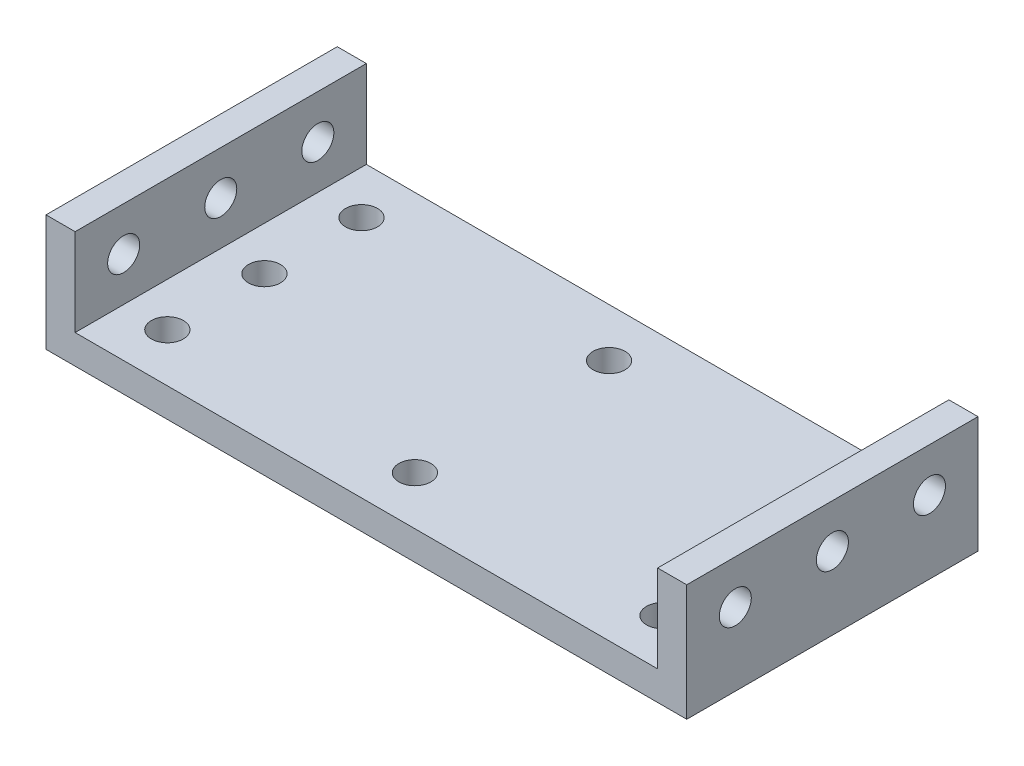
ISO-10303-21;
HEADER;
FILE_DESCRIPTION(('STEP AP214'),'2;1');
FILE_NAME('part.step','',(''),(''),'','','');
FILE_SCHEMA(('AUTOMOTIVE_DESIGN { 1 0 10303 214 1 1 1 1 }'));
ENDSEC;
DATA;
#1=APPLICATION_CONTEXT('core data for automotive mechanical design processes');
#2=APPLICATION_PROTOCOL_DEFINITION('international standard','automotive_design',2000,#1);
#3=PRODUCT_CONTEXT('',#1,'mechanical');
#4=PRODUCT('Part','Part','',(#3));
#5=PRODUCT_RELATED_PRODUCT_CATEGORY('part','',(#4));
#6=PRODUCT_DEFINITION_FORMATION('','',#4);
#7=PRODUCT_DEFINITION_CONTEXT('part definition',#1,'design');
#8=PRODUCT_DEFINITION('design','',#6,#7);
#9=PRODUCT_DEFINITION_SHAPE('','',#8);
#10=(LENGTH_UNIT() NAMED_UNIT(*) SI_UNIT(.MILLI.,.METRE.));
#11=(NAMED_UNIT(*) PLANE_ANGLE_UNIT() SI_UNIT($,.RADIAN.));
#12=(NAMED_UNIT(*) SI_UNIT($,.STERADIAN.) SOLID_ANGLE_UNIT());
#13=UNCERTAINTY_MEASURE_WITH_UNIT(LENGTH_MEASURE(1.E-05),#10,'distance_accuracy_value','');
#14=(GEOMETRIC_REPRESENTATION_CONTEXT(3) GLOBAL_UNCERTAINTY_ASSIGNED_CONTEXT((#13)) GLOBAL_UNIT_ASSIGNED_CONTEXT((#10,
#11,#12)) REPRESENTATION_CONTEXT('',''));
#15=CARTESIAN_POINT('',(0.,0.,0.));
#16=DIRECTION('',(0.,0.,1.));
#17=DIRECTION('',(1.,0.,0.));
#18=AXIS2_PLACEMENT_3D('',#15,#16,#17);
#19=CARTESIAN_POINT('',(60.,0.,30.));
#20=DIRECTION('',(0.,-1.,0.));
#21=DIRECTION('',(1.,0.,0.));
#22=AXIS2_PLACEMENT_3D('',#19,#20,#21);
#23=PLANE('',#22);
#24=CARTESIAN_POINT('',(55.5,0.,5.));
#25=DIRECTION('',(0.,1.,0.));
#26=DIRECTION('',(-1.,0.,0.));
#27=AXIS2_PLACEMENT_3D('',#24,#25,#26);
#28=CIRCLE('',#27,1.65);
#29=CARTESIAN_POINT('',(53.85,0.,5.));
#30=VERTEX_POINT('',#29);
#31=EDGE_CURVE('E263',#30,#30,#28,.T.);
#32=ORIENTED_EDGE('',*,*,#31,.F.);
#33=EDGE_LOOP('',(#32));
#34=FACE_BOUND('',#33,.T.);
#35=CARTESIAN_POINT('',(55.5,0.,15.));
#36=DIRECTION('',(0.,1.,0.));
#37=DIRECTION('',(-1.,0.,0.));
#38=AXIS2_PLACEMENT_3D('',#35,#36,#37);
#39=CIRCLE('',#38,1.65);
#40=CARTESIAN_POINT('',(53.85,0.,15.));
#41=VERTEX_POINT('',#40);
#42=EDGE_CURVE('E267',#41,#41,#39,.T.);
#43=ORIENTED_EDGE('',*,*,#42,.F.);
#44=EDGE_LOOP('',(#43));
#45=FACE_BOUND('',#44,.T.);
#46=CARTESIAN_POINT('',(55.5,0.,25.));
#47=DIRECTION('',(0.,1.,0.));
#48=DIRECTION('',(-1.,0.,0.));
#49=AXIS2_PLACEMENT_3D('',#46,#47,#48);
#50=CIRCLE('',#49,1.65);
#51=CARTESIAN_POINT('',(53.85,0.,25.));
#52=VERTEX_POINT('',#51);
#53=EDGE_CURVE('E271',#52,#52,#50,.T.);
#54=ORIENTED_EDGE('',*,*,#53,.F.);
#55=EDGE_LOOP('',(#54));
#56=FACE_BOUND('',#55,.T.);
#57=CARTESIAN_POINT('',(4.50000000000001,0.,25.));
#58=DIRECTION('',(0.,1.,0.));
#59=DIRECTION('',(-1.,0.,0.));
#60=AXIS2_PLACEMENT_3D('',#57,#58,#59);
#61=CIRCLE('',#60,1.65);
#62=CARTESIAN_POINT('',(2.85000000000001,0.,25.));
#63=VERTEX_POINT('',#62);
#64=EDGE_CURVE('E275',#63,#63,#61,.T.);
#65=ORIENTED_EDGE('',*,*,#64,.F.);
#66=EDGE_LOOP('',(#65));
#67=FACE_BOUND('',#66,.T.);
#68=CARTESIAN_POINT('',(4.50000000000001,0.,15.));
#69=DIRECTION('',(0.,1.,0.));
#70=DIRECTION('',(-1.,0.,0.));
#71=AXIS2_PLACEMENT_3D('',#68,#69,#70);
#72=CIRCLE('',#71,1.65);
#73=CARTESIAN_POINT('',(2.85000000000001,0.,15.));
#74=VERTEX_POINT('',#73);
#75=EDGE_CURVE('E279',#74,#74,#72,.T.);
#76=ORIENTED_EDGE('',*,*,#75,.F.);
#77=EDGE_LOOP('',(#76));
#78=FACE_BOUND('',#77,.T.);
#79=CARTESIAN_POINT('',(4.5,0.,5.00000000000001));
#80=DIRECTION('',(0.,1.,0.));
#81=DIRECTION('',(-1.,0.,0.));
#82=AXIS2_PLACEMENT_3D('',#79,#80,#81);
#83=CIRCLE('',#82,1.65);
#84=CARTESIAN_POINT('',(2.85,0.,5.00000000000001));
#85=VERTEX_POINT('',#84);
#86=EDGE_CURVE('E283',#85,#85,#83,.T.);
#87=ORIENTED_EDGE('',*,*,#86,.F.);
#88=EDGE_LOOP('',(#87));
#89=FACE_BOUND('',#88,.T.);
#90=CARTESIAN_POINT('',(30.,0.,5.00000000000001));
#91=DIRECTION('',(0.,1.,0.));
#92=DIRECTION('',(-1.,0.,0.));
#93=AXIS2_PLACEMENT_3D('',#90,#91,#92);
#94=CIRCLE('',#93,1.65);
#95=CARTESIAN_POINT('',(28.35,0.,5.00000000000001));
#96=VERTEX_POINT('',#95);
#97=EDGE_CURVE('E287',#96,#96,#94,.T.);
#98=ORIENTED_EDGE('',*,*,#97,.F.);
#99=EDGE_LOOP('',(#98));
#100=FACE_BOUND('',#99,.T.);
#101=CARTESIAN_POINT('',(30.,0.,25.));
#102=DIRECTION('',(0.,1.,0.));
#103=DIRECTION('',(-1.,0.,0.));
#104=AXIS2_PLACEMENT_3D('',#101,#102,#103);
#105=CIRCLE('',#104,1.65);
#106=CARTESIAN_POINT('',(28.35,0.,25.));
#107=VERTEX_POINT('',#106);
#108=EDGE_CURVE('E291',#107,#107,#105,.T.);
#109=ORIENTED_EDGE('',*,*,#108,.F.);
#110=EDGE_LOOP('',(#109));
#111=FACE_BOUND('',#110,.T.);
#112=DIRECTION('',(-1.,0.,0.));
#113=VECTOR('',#112,1.);
#114=CARTESIAN_POINT('',(60.,0.,0.));
#115=LINE('',#114,#113);
#116=CARTESIAN_POINT('',(60.,0.,0.));
#117=VERTEX_POINT('',#116);
#118=CARTESIAN_POINT('',(0.,0.,0.));
#119=VERTEX_POINT('',#118);
#120=EDGE_CURVE('E145',#117,#119,#115,.T.);
#121=ORIENTED_EDGE('',*,*,#120,.T.);
#122=DIRECTION('',(0.,0.,-1.));
#123=VECTOR('',#122,1.);
#124=CARTESIAN_POINT('',(0.,0.,30.));
#125=LINE('',#124,#123);
#126=CARTESIAN_POINT('',(0.,0.,30.));
#127=VERTEX_POINT('',#126);
#128=EDGE_CURVE('E11',#127,#119,#125,.T.);
#129=ORIENTED_EDGE('',*,*,#128,.F.);
#130=DIRECTION('',(-1.,0.,0.));
#131=VECTOR('',#130,1.);
#132=CARTESIAN_POINT('',(60.,0.,30.));
#133=LINE('',#132,#131);
#134=CARTESIAN_POINT('',(60.,0.,30.));
#135=VERTEX_POINT('',#134);
#136=EDGE_CURVE('E168',#135,#127,#133,.T.);
#137=ORIENTED_EDGE('',*,*,#136,.F.);
#138=DIRECTION('',(0.,0.,-1.));
#139=VECTOR('',#138,1.);
#140=CARTESIAN_POINT('',(60.,0.,30.));
#141=LINE('',#140,#139);
#142=EDGE_CURVE('E141',#135,#117,#141,.T.);
#143=ORIENTED_EDGE('',*,*,#142,.T.);
#144=EDGE_LOOP('',(#121,#129,#137,#143));
#145=FACE_BOUND('',#144,.T.);
#146=ADVANCED_FACE('F42',(#34,#45,#56,#67,#78,#89,#100,#111,#145),#23,.F.);
#147=CARTESIAN_POINT('',(0.,0.,30.));
#148=DIRECTION('',(-1.,0.,0.));
#149=DIRECTION('',(0.,0.,1.));
#150=AXIS2_PLACEMENT_3D('',#147,#148,#149);
#151=PLANE('',#150);
#152=CARTESIAN_POINT('',(0.,4.5,25.));
#153=DIRECTION('',(-1.,0.,0.));
#154=DIRECTION('',(0.,0.,1.));
#155=AXIS2_PLACEMENT_3D('',#152,#153,#154);
#156=CIRCLE('',#155,1.65);
#157=CARTESIAN_POINT('',(0.,4.5,26.65));
#158=VERTEX_POINT('',#157);
#159=EDGE_CURVE('E150',#158,#158,#156,.T.);
#160=ORIENTED_EDGE('',*,*,#159,.T.);
#161=EDGE_LOOP('',(#160));
#162=FACE_BOUND('',#161,.T.);
#163=CARTESIAN_POINT('',(0.,4.5,5.));
#164=DIRECTION('',(-1.,0.,0.));
#165=DIRECTION('',(0.,0.,1.));
#166=AXIS2_PLACEMENT_3D('',#163,#164,#165);
#167=CIRCLE('',#166,1.65);
#168=CARTESIAN_POINT('',(0.,4.5,6.65));
#169=VERTEX_POINT('',#168);
#170=EDGE_CURVE('E194',#169,#169,#167,.T.);
#171=ORIENTED_EDGE('',*,*,#170,.T.);
#172=EDGE_LOOP('',(#171));
#173=FACE_BOUND('',#172,.T.);
#174=CARTESIAN_POINT('',(0.,4.5,15.));
#175=DIRECTION('',(-1.,0.,0.));
#176=DIRECTION('',(0.,0.,1.));
#177=AXIS2_PLACEMENT_3D('',#174,#175,#176);
#178=CIRCLE('',#177,1.65);
#179=CARTESIAN_POINT('',(0.,4.5,16.65));
#180=VERTEX_POINT('',#179);
#181=EDGE_CURVE('E189',#180,#180,#178,.T.);
#182=ORIENTED_EDGE('',*,*,#181,.T.);
#183=EDGE_LOOP('',(#182));
#184=FACE_BOUND('',#183,.T.);
#185=DIRECTION('',(0.,1.,0.));
#186=VECTOR('',#185,1.);
#187=CARTESIAN_POINT('',(0.,0.,0.));
#188=LINE('',#187,#186);
#189=CARTESIAN_POINT('',(0.,9.,0.));
#190=VERTEX_POINT('',#189);
#191=EDGE_CURVE('E149',#119,#190,#188,.T.);
#192=ORIENTED_EDGE('',*,*,#191,.T.);
#193=DIRECTION('',(0.,0.,-1.));
#194=VECTOR('',#193,1.);
#195=CARTESIAN_POINT('',(0.,9.,30.));
#196=LINE('',#195,#194);
#197=CARTESIAN_POINT('',(0.,9.,30.));
#198=VERTEX_POINT('',#197);
#199=EDGE_CURVE('E52',#198,#190,#196,.T.);
#200=ORIENTED_EDGE('',*,*,#199,.F.);
#201=DIRECTION('',(0.,1.,0.));
#202=VECTOR('',#201,1.);
#203=CARTESIAN_POINT('',(0.,0.,30.));
#204=LINE('',#203,#202);
#205=EDGE_CURVE('E104',#127,#198,#204,.T.);
#206=ORIENTED_EDGE('',*,*,#205,.F.);
#207=ORIENTED_EDGE('',*,*,#128,.T.);
#208=EDGE_LOOP('',(#192,#200,#206,#207));
#209=FACE_BOUND('',#208,.T.);
#210=ADVANCED_FACE('F251',(#162,#173,#184,#209),#151,.F.);
#211=CARTESIAN_POINT('',(0.,9.,30.));
#212=DIRECTION('',(0.,-1.,0.));
#213=DIRECTION('',(0.,0.,-1.));
#214=AXIS2_PLACEMENT_3D('',#211,#212,#213);
#215=PLANE('',#214);
#216=DIRECTION('',(-1.,0.,0.));
#217=VECTOR('',#216,1.);
#218=CARTESIAN_POINT('',(0.,9.,0.));
#219=LINE('',#218,#217);
#220=CARTESIAN_POINT('',(-3.,9.,0.));
#221=VERTEX_POINT('',#220);
#222=EDGE_CURVE('E153',#190,#221,#219,.T.);
#223=ORIENTED_EDGE('',*,*,#222,.T.);
#224=DIRECTION('',(0.,0.,-1.));
#225=VECTOR('',#224,1.);
#226=CARTESIAN_POINT('',(-3.,9.,30.));
#227=LINE('',#226,#225);
#228=CARTESIAN_POINT('',(-3.,9.,30.));
#229=VERTEX_POINT('',#228);
#230=EDGE_CURVE('E179',#229,#221,#227,.T.);
#231=ORIENTED_EDGE('',*,*,#230,.F.);
#232=DIRECTION('',(-1.,0.,0.));
#233=VECTOR('',#232,1.);
#234=CARTESIAN_POINT('',(0.,9.,30.));
#235=LINE('',#234,#233);
#236=EDGE_CURVE('E216',#198,#229,#235,.T.);
#237=ORIENTED_EDGE('',*,*,#236,.F.);
#238=ORIENTED_EDGE('',*,*,#199,.T.);
#239=EDGE_LOOP('',(#223,#231,#237,#238));
#240=FACE_BOUND('',#239,.T.);
#241=ADVANCED_FACE('F258',(#240),#215,.F.);
#242=CARTESIAN_POINT('',(-3.,9.,30.));
#243=DIRECTION('',(1.,0.,0.));
#244=DIRECTION('',(0.,1.,0.));
#245=AXIS2_PLACEMENT_3D('',#242,#243,#244);
#246=PLANE('',#245);
#247=CARTESIAN_POINT('',(-3.00000000000002,4.5,25.));
#248=DIRECTION('',(1.,0.,0.));
#249=DIRECTION('',(0.,0.,-1.));
#250=AXIS2_PLACEMENT_3D('',#247,#248,#249);
#251=CIRCLE('',#250,1.65);
#252=CARTESIAN_POINT('',(-3.00000000000002,4.5,23.35));
#253=VERTEX_POINT('',#252);
#254=EDGE_CURVE('E190',#253,#253,#251,.T.);
#255=ORIENTED_EDGE('',*,*,#254,.T.);
#256=EDGE_LOOP('',(#255));
#257=FACE_BOUND('',#256,.T.);
#258=CARTESIAN_POINT('',(-3.00000000000002,4.5,5.));
#259=DIRECTION('',(1.,0.,0.));
#260=DIRECTION('',(0.,0.,-1.));
#261=AXIS2_PLACEMENT_3D('',#258,#259,#260);
#262=CIRCLE('',#261,1.65);
#263=CARTESIAN_POINT('',(-3.00000000000002,4.5,3.35));
#264=VERTEX_POINT('',#263);
#265=EDGE_CURVE('E589',#264,#264,#262,.T.);
#266=ORIENTED_EDGE('',*,*,#265,.T.);
#267=EDGE_LOOP('',(#266));
#268=FACE_BOUND('',#267,.T.);
#269=CARTESIAN_POINT('',(-3.00000000000002,4.5,15.));
#270=DIRECTION('',(1.,0.,0.));
#271=DIRECTION('',(0.,0.,-1.));
#272=AXIS2_PLACEMENT_3D('',#269,#270,#271);
#273=CIRCLE('',#272,1.65);
#274=CARTESIAN_POINT('',(-3.00000000000002,4.5,13.35));
#275=VERTEX_POINT('',#274);
#276=EDGE_CURVE('E206',#275,#275,#273,.T.);
#277=ORIENTED_EDGE('',*,*,#276,.T.);
#278=EDGE_LOOP('',(#277));
#279=FACE_BOUND('',#278,.T.);
#280=DIRECTION('',(0.,-1.,0.));
#281=VECTOR('',#280,1.);
#282=CARTESIAN_POINT('',(-3.,9.,0.));
#283=LINE('',#282,#281);
#284=CARTESIAN_POINT('',(-3.00000000000002,-3.,0.));
#285=VERTEX_POINT('',#284);
#286=EDGE_CURVE('E156',#221,#285,#283,.T.);
#287=ORIENTED_EDGE('',*,*,#286,.T.);
#288=DIRECTION('',(0.,0.,-1.));
#289=VECTOR('',#288,1.);
#290=CARTESIAN_POINT('',(-3.00000000000002,-3.,30.));
#291=LINE('',#290,#289);
#292=CARTESIAN_POINT('',(-3.00000000000002,-3.,30.));
#293=VERTEX_POINT('',#292);
#294=EDGE_CURVE('E175',#293,#285,#291,.T.);
#295=ORIENTED_EDGE('',*,*,#294,.F.);
#296=DIRECTION('',(0.,-1.,0.));
#297=VECTOR('',#296,1.);
#298=CARTESIAN_POINT('',(-3.,9.,30.));
#299=LINE('',#298,#297);
#300=EDGE_CURVE('E219',#229,#293,#299,.T.);
#301=ORIENTED_EDGE('',*,*,#300,.F.);
#302=ORIENTED_EDGE('',*,*,#230,.T.);
#303=EDGE_LOOP('',(#287,#295,#301,#302));
#304=FACE_BOUND('',#303,.T.);
#305=ADVANCED_FACE('F305',(#257,#268,#279,#304),#246,.F.);
#306=CARTESIAN_POINT('',(-3.00000000000002,-3.,30.));
#307=DIRECTION('',(0.,1.,0.));
#308=DIRECTION('',(0.,0.,1.));
#309=AXIS2_PLACEMENT_3D('',#306,#307,#308);
#310=PLANE('',#309);
#311=CARTESIAN_POINT('',(55.5,-3.,5.));
#312=DIRECTION('',(0.,1.,0.));
#313=DIRECTION('',(0.,0.,1.));
#314=AXIS2_PLACEMENT_3D('',#311,#312,#313);
#315=CIRCLE('',#314,1.65);
#316=CARTESIAN_POINT('',(55.5,-3.,6.65));
#317=VERTEX_POINT('',#316);
#318=EDGE_CURVE('E552',#317,#317,#315,.F.);
#319=ORIENTED_EDGE('',*,*,#318,.F.);
#320=EDGE_LOOP('',(#319));
#321=FACE_BOUND('',#320,.T.);
#322=CARTESIAN_POINT('',(55.5,-3.,15.));
#323=DIRECTION('',(0.,1.,0.));
#324=DIRECTION('',(0.,0.,1.));
#325=AXIS2_PLACEMENT_3D('',#322,#323,#324);
#326=CIRCLE('',#325,1.65);
#327=CARTESIAN_POINT('',(55.5,-3.,16.65));
#328=VERTEX_POINT('',#327);
#329=EDGE_CURVE('E556',#328,#328,#326,.F.);
#330=ORIENTED_EDGE('',*,*,#329,.F.);
#331=EDGE_LOOP('',(#330));
#332=FACE_BOUND('',#331,.T.);
#333=CARTESIAN_POINT('',(55.5,-3.,25.));
#334=DIRECTION('',(0.,1.,0.));
#335=DIRECTION('',(0.,0.,1.));
#336=AXIS2_PLACEMENT_3D('',#333,#334,#335);
#337=CIRCLE('',#336,1.65);
#338=CARTESIAN_POINT('',(55.5,-3.,26.65));
#339=VERTEX_POINT('',#338);
#340=EDGE_CURVE('E615',#339,#339,#337,.F.);
#341=ORIENTED_EDGE('',*,*,#340,.F.);
#342=EDGE_LOOP('',(#341));
#343=FACE_BOUND('',#342,.T.);
#344=CARTESIAN_POINT('',(4.50000000000001,-3.,25.));
#345=DIRECTION('',(0.,1.,0.));
#346=DIRECTION('',(0.,0.,1.));
#347=AXIS2_PLACEMENT_3D('',#344,#345,#346);
#348=CIRCLE('',#347,1.65);
#349=CARTESIAN_POINT('',(4.50000000000001,-3.,26.65));
#350=VERTEX_POINT('',#349);
#351=EDGE_CURVE('E609',#350,#350,#348,.F.);
#352=ORIENTED_EDGE('',*,*,#351,.F.);
#353=EDGE_LOOP('',(#352));
#354=FACE_BOUND('',#353,.T.);
#355=CARTESIAN_POINT('',(4.50000000000001,-3.,15.));
#356=DIRECTION('',(0.,1.,0.));
#357=DIRECTION('',(0.,0.,1.));
#358=AXIS2_PLACEMENT_3D('',#355,#356,#357);
#359=CIRCLE('',#358,1.65);
#360=CARTESIAN_POINT('',(4.50000000000001,-3.,16.65));
#361=VERTEX_POINT('',#360);
#362=EDGE_CURVE('E603',#361,#361,#359,.F.);
#363=ORIENTED_EDGE('',*,*,#362,.F.);
#364=EDGE_LOOP('',(#363));
#365=FACE_BOUND('',#364,.T.);
#366=CARTESIAN_POINT('',(4.5,-3.,5.00000000000001));
#367=DIRECTION('',(0.,1.,0.));
#368=DIRECTION('',(0.,0.,1.));
#369=AXIS2_PLACEMENT_3D('',#366,#367,#368);
#370=CIRCLE('',#369,1.65);
#371=CARTESIAN_POINT('',(4.5,-3.,6.65000000000001));
#372=VERTEX_POINT('',#371);
#373=EDGE_CURVE('E563',#372,#372,#370,.F.);
#374=ORIENTED_EDGE('',*,*,#373,.F.);
#375=EDGE_LOOP('',(#374));
#376=FACE_BOUND('',#375,.T.);
#377=CARTESIAN_POINT('',(30.,-3.,5.00000000000001));
#378=DIRECTION('',(0.,1.,0.));
#379=DIRECTION('',(0.,0.,1.));
#380=AXIS2_PLACEMENT_3D('',#377,#378,#379);
#381=CIRCLE('',#380,1.65);
#382=CARTESIAN_POINT('',(30.,-3.,6.65000000000001));
#383=VERTEX_POINT('',#382);
#384=EDGE_CURVE('E570',#383,#383,#381,.F.);
#385=ORIENTED_EDGE('',*,*,#384,.F.);
#386=EDGE_LOOP('',(#385));
#387=FACE_BOUND('',#386,.T.);
#388=CARTESIAN_POINT('',(30.,-3.,25.));
#389=DIRECTION('',(0.,1.,0.));
#390=DIRECTION('',(0.,0.,1.));
#391=AXIS2_PLACEMENT_3D('',#388,#389,#390);
#392=CIRCLE('',#391,1.65);
#393=CARTESIAN_POINT('',(30.,-3.,26.65));
#394=VERTEX_POINT('',#393);
#395=EDGE_CURVE('E567',#394,#394,#392,.F.);
#396=ORIENTED_EDGE('',*,*,#395,.F.);
#397=EDGE_LOOP('',(#396));
#398=FACE_BOUND('',#397,.T.);
#399=DIRECTION('',(1.,0.,0.));
#400=VECTOR('',#399,1.);
#401=CARTESIAN_POINT('',(-3.00000000000002,-3.,0.));
#402=LINE('',#401,#400);
#403=CARTESIAN_POINT('',(63.,-3.,0.));
#404=VERTEX_POINT('',#403);
#405=EDGE_CURVE('E159',#285,#404,#402,.T.);
#406=ORIENTED_EDGE('',*,*,#405,.T.);
#407=DIRECTION('',(0.,0.,-1.));
#408=VECTOR('',#407,1.);
#409=CARTESIAN_POINT('',(63.,-3.,30.));
#410=LINE('',#409,#408);
#411=CARTESIAN_POINT('',(63.,-3.,30.));
#412=VERTEX_POINT('',#411);
#413=EDGE_CURVE('E134',#412,#404,#410,.T.);
#414=ORIENTED_EDGE('',*,*,#413,.F.);
#415=DIRECTION('',(1.,0.,0.));
#416=VECTOR('',#415,1.);
#417=CARTESIAN_POINT('',(-3.00000000000002,-3.,30.));
#418=LINE('',#417,#416);
#419=EDGE_CURVE('E123',#293,#412,#418,.T.);
#420=ORIENTED_EDGE('',*,*,#419,.F.);
#421=ORIENTED_EDGE('',*,*,#294,.T.);
#422=EDGE_LOOP('',(#406,#414,#420,#421));
#423=FACE_BOUND('',#422,.T.);
#424=ADVANCED_FACE('F308',(#321,#332,#343,#354,#365,#376,#387,#398,#423),#310,.F.);
#425=CARTESIAN_POINT('',(63.,-3.,30.));
#426=DIRECTION('',(-1.,0.,0.));
#427=DIRECTION('',(0.,0.,1.));
#428=AXIS2_PLACEMENT_3D('',#425,#426,#427);
#429=PLANE('',#428);
#430=CARTESIAN_POINT('',(63.,4.5,25.));
#431=DIRECTION('',(1.,0.,0.));
#432=DIRECTION('',(0.,0.,-1.));
#433=AXIS2_PLACEMENT_3D('',#430,#431,#432);
#434=CIRCLE('',#433,1.65);
#435=CARTESIAN_POINT('',(63.,4.5,23.35));
#436=VERTEX_POINT('',#435);
#437=EDGE_CURVE('E582',#436,#436,#434,.T.);
#438=ORIENTED_EDGE('',*,*,#437,.F.);
#439=EDGE_LOOP('',(#438));
#440=FACE_BOUND('',#439,.T.);
#441=CARTESIAN_POINT('',(63.,4.5,5.));
#442=DIRECTION('',(1.,0.,0.));
#443=DIRECTION('',(0.,0.,-1.));
#444=AXIS2_PLACEMENT_3D('',#441,#442,#443);
#445=CIRCLE('',#444,1.65);
#446=CARTESIAN_POINT('',(63.,4.5,3.35));
#447=VERTEX_POINT('',#446);
#448=EDGE_CURVE('E585',#447,#447,#445,.T.);
#449=ORIENTED_EDGE('',*,*,#448,.F.);
#450=EDGE_LOOP('',(#449));
#451=FACE_BOUND('',#450,.T.);
#452=CARTESIAN_POINT('',(63.,4.5,15.));
#453=DIRECTION('',(1.,0.,0.));
#454=DIRECTION('',(0.,0.,-1.));
#455=AXIS2_PLACEMENT_3D('',#452,#453,#454);
#456=CIRCLE('',#455,1.65);
#457=CARTESIAN_POINT('',(63.,4.5,13.35));
#458=VERTEX_POINT('',#457);
#459=EDGE_CURVE('E592',#458,#458,#456,.T.);
#460=ORIENTED_EDGE('',*,*,#459,.F.);
#461=EDGE_LOOP('',(#460));
#462=FACE_BOUND('',#461,.T.);
#463=DIRECTION('',(0.,1.,0.));
#464=VECTOR('',#463,1.);
#465=CARTESIAN_POINT('',(63.,-3.,0.));
#466=LINE('',#465,#464);
#467=CARTESIAN_POINT('',(63.,9.00000000000001,0.));
#468=VERTEX_POINT('',#467);
#469=EDGE_CURVE('E132',#404,#468,#466,.T.);
#470=ORIENTED_EDGE('',*,*,#469,.T.);
#471=DIRECTION('',(0.,0.,-1.));
#472=VECTOR('',#471,1.);
#473=CARTESIAN_POINT('',(63.,9.00000000000001,30.));
#474=LINE('',#473,#472);
#475=CARTESIAN_POINT('',(63.,9.00000000000001,30.));
#476=VERTEX_POINT('',#475);
#477=EDGE_CURVE('E129',#476,#468,#474,.T.);
#478=ORIENTED_EDGE('',*,*,#477,.F.);
#479=DIRECTION('',(0.,1.,0.));
#480=VECTOR('',#479,1.);
#481=CARTESIAN_POINT('',(63.,-3.,30.));
#482=LINE('',#481,#480);
#483=EDGE_CURVE('E117',#412,#476,#482,.T.);
#484=ORIENTED_EDGE('',*,*,#483,.F.);
#485=ORIENTED_EDGE('',*,*,#413,.T.);
#486=EDGE_LOOP('',(#470,#478,#484,#485));
#487=FACE_BOUND('',#486,.T.);
#488=ADVANCED_FACE('F130',(#440,#451,#462,#487),#429,.F.);
#489=CARTESIAN_POINT('',(63.,9.00000000000001,30.));
#490=DIRECTION('',(0.,-1.,0.));
#491=DIRECTION('',(1.,0.,0.));
#492=AXIS2_PLACEMENT_3D('',#489,#490,#491);
#493=PLANE('',#492);
#494=DIRECTION('',(-1.,0.,0.));
#495=VECTOR('',#494,1.);
#496=CARTESIAN_POINT('',(63.,9.00000000000001,0.));
#497=LINE('',#496,#495);
#498=CARTESIAN_POINT('',(60.,9.,0.));
#499=VERTEX_POINT('',#498);
#500=EDGE_CURVE('E90',#468,#499,#497,.T.);
#501=ORIENTED_EDGE('',*,*,#500,.T.);
#502=DIRECTION('',(0.,0.,-1.));
#503=VECTOR('',#502,1.);
#504=CARTESIAN_POINT('',(60.,9.,30.));
#505=LINE('',#504,#503);
#506=CARTESIAN_POINT('',(60.,9.,30.));
#507=VERTEX_POINT('',#506);
#508=EDGE_CURVE('E135',#507,#499,#505,.T.);
#509=ORIENTED_EDGE('',*,*,#508,.F.);
#510=DIRECTION('',(-1.,0.,0.));
#511=VECTOR('',#510,1.);
#512=CARTESIAN_POINT('',(63.,9.00000000000001,30.));
#513=LINE('',#512,#511);
#514=EDGE_CURVE('E121',#476,#507,#513,.T.);
#515=ORIENTED_EDGE('',*,*,#514,.F.);
#516=ORIENTED_EDGE('',*,*,#477,.T.);
#517=EDGE_LOOP('',(#501,#509,#515,#516));
#518=FACE_BOUND('',#517,.T.);
#519=ADVANCED_FACE('F137',(#518),#493,.F.);
#520=CARTESIAN_POINT('',(60.,9.,30.));
#521=DIRECTION('',(1.,0.,0.));
#522=DIRECTION('',(0.,1.,0.));
#523=AXIS2_PLACEMENT_3D('',#520,#521,#522);
#524=PLANE('',#523);
#525=CARTESIAN_POINT('',(60.,4.5,25.));
#526=DIRECTION('',(1.,0.,0.));
#527=DIRECTION('',(0.,1.,0.));
#528=AXIS2_PLACEMENT_3D('',#525,#526,#527);
#529=CIRCLE('',#528,1.65);
#530=CARTESIAN_POINT('',(60.,6.15,25.));
#531=VERTEX_POINT('',#530);
#532=EDGE_CURVE('E45',#531,#531,#529,.T.);
#533=ORIENTED_EDGE('',*,*,#532,.T.);
#534=EDGE_LOOP('',(#533));
#535=FACE_BOUND('',#534,.T.);
#536=CARTESIAN_POINT('',(60.,4.5,5.));
#537=DIRECTION('',(1.,0.,0.));
#538=DIRECTION('',(0.,1.,0.));
#539=AXIS2_PLACEMENT_3D('',#536,#537,#538);
#540=CIRCLE('',#539,1.65);
#541=CARTESIAN_POINT('',(60.,6.15000000000001,5.));
#542=VERTEX_POINT('',#541);
#543=EDGE_CURVE('E191',#542,#542,#540,.T.);
#544=ORIENTED_EDGE('',*,*,#543,.T.);
#545=EDGE_LOOP('',(#544));
#546=FACE_BOUND('',#545,.T.);
#547=CARTESIAN_POINT('',(60.,4.5,15.));
#548=DIRECTION('',(1.,0.,0.));
#549=DIRECTION('',(0.,1.,0.));
#550=AXIS2_PLACEMENT_3D('',#547,#548,#549);
#551=CIRCLE('',#550,1.65);
#552=CARTESIAN_POINT('',(60.,6.15000000000001,15.));
#553=VERTEX_POINT('',#552);
#554=EDGE_CURVE('E186',#553,#553,#551,.T.);
#555=ORIENTED_EDGE('',*,*,#554,.T.);
#556=EDGE_LOOP('',(#555));
#557=FACE_BOUND('',#556,.T.);
#558=DIRECTION('',(0.,-1.,0.));
#559=VECTOR('',#558,1.);
#560=CARTESIAN_POINT('',(60.,9.,0.));
#561=LINE('',#560,#559);
#562=EDGE_CURVE('E96',#499,#117,#561,.T.);
#563=ORIENTED_EDGE('',*,*,#562,.T.);
#564=ORIENTED_EDGE('',*,*,#142,.F.);
#565=DIRECTION('',(0.,-1.,0.));
#566=VECTOR('',#565,1.);
#567=CARTESIAN_POINT('',(60.,9.,30.));
#568=LINE('',#567,#566);
#569=EDGE_CURVE('E61',#507,#135,#568,.T.);
#570=ORIENTED_EDGE('',*,*,#569,.F.);
#571=ORIENTED_EDGE('',*,*,#508,.T.);
#572=EDGE_LOOP('',(#563,#564,#570,#571));
#573=FACE_BOUND('',#572,.T.);
#574=ADVANCED_FACE('F226',(#535,#546,#557,#573),#524,.F.);
#575=CARTESIAN_POINT('',(0.,0.,30.));
#576=DIRECTION('',(0.,0.,-1.));
#577=DIRECTION('',(-1.,0.,0.));
#578=AXIS2_PLACEMENT_3D('',#575,#576,#577);
#579=PLANE('',#578);
#580=ORIENTED_EDGE('',*,*,#136,.T.);
#581=ORIENTED_EDGE('',*,*,#205,.T.);
#582=ORIENTED_EDGE('',*,*,#236,.T.);
#583=ORIENTED_EDGE('',*,*,#300,.T.);
#584=ORIENTED_EDGE('',*,*,#419,.T.);
#585=ORIENTED_EDGE('',*,*,#483,.T.);
#586=ORIENTED_EDGE('',*,*,#514,.T.);
#587=ORIENTED_EDGE('',*,*,#569,.T.);
#588=EDGE_LOOP('',(#580,#581,#582,#583,#584,#585,#586,#587));
#589=FACE_BOUND('',#588,.T.);
#590=ADVANCED_FACE('F119',(#589),#579,.F.);
#591=CARTESIAN_POINT('',(0.,0.,0.));
#592=DIRECTION('',(0.,0.,-1.));
#593=DIRECTION('',(-1.,0.,0.));
#594=AXIS2_PLACEMENT_3D('',#591,#592,#593);
#595=PLANE('',#594);
#596=ORIENTED_EDGE('',*,*,#120,.F.);
#597=ORIENTED_EDGE('',*,*,#562,.F.);
#598=ORIENTED_EDGE('',*,*,#500,.F.);
#599=ORIENTED_EDGE('',*,*,#469,.F.);
#600=ORIENTED_EDGE('',*,*,#405,.F.);
#601=ORIENTED_EDGE('',*,*,#286,.F.);
#602=ORIENTED_EDGE('',*,*,#222,.F.);
#603=ORIENTED_EDGE('',*,*,#191,.F.);
#604=EDGE_LOOP('',(#596,#597,#598,#599,#600,#601,#602,#603));
#605=FACE_BOUND('',#604,.T.);
#606=ADVANCED_FACE('F296',(#605),#595,.T.);
#607=CARTESIAN_POINT('',(-3.00000000000002,4.5,15.));
#608=DIRECTION('',(1.,0.,0.));
#609=DIRECTION('',(0.,0.,-1.));
#610=AXIS2_PLACEMENT_3D('',#607,#608,#609);
#611=CYLINDRICAL_SURFACE('',#610,1.65);
#612=ORIENTED_EDGE('',*,*,#459,.T.);
#613=EDGE_LOOP('',(#612));
#614=FACE_BOUND('',#613,.T.);
#615=ORIENTED_EDGE('',*,*,#554,.F.);
#616=EDGE_LOOP('',(#615));
#617=FACE_BOUND('',#616,.T.);
#618=ADVANCED_FACE('F242',(#614,#617),#611,.F.);
#619=CARTESIAN_POINT('',(-3.00000000000002,4.5,5.));
#620=DIRECTION('',(1.,0.,0.));
#621=DIRECTION('',(0.,0.,-1.));
#622=AXIS2_PLACEMENT_3D('',#619,#620,#621);
#623=CYLINDRICAL_SURFACE('',#622,1.65);
#624=ORIENTED_EDGE('',*,*,#448,.T.);
#625=EDGE_LOOP('',(#624));
#626=FACE_BOUND('',#625,.T.);
#627=ORIENTED_EDGE('',*,*,#543,.F.);
#628=EDGE_LOOP('',(#627));
#629=FACE_BOUND('',#628,.T.);
#630=ADVANCED_FACE('F231',(#626,#629),#623,.F.);
#631=CARTESIAN_POINT('',(-3.00000000000002,4.5,25.));
#632=DIRECTION('',(1.,0.,0.));
#633=DIRECTION('',(0.,0.,-1.));
#634=AXIS2_PLACEMENT_3D('',#631,#632,#633);
#635=CYLINDRICAL_SURFACE('',#634,1.65);
#636=ORIENTED_EDGE('',*,*,#437,.T.);
#637=EDGE_LOOP('',(#636));
#638=FACE_BOUND('',#637,.T.);
#639=ORIENTED_EDGE('',*,*,#532,.F.);
#640=EDGE_LOOP('',(#639));
#641=FACE_BOUND('',#640,.T.);
#642=ADVANCED_FACE('F228',(#638,#641),#635,.F.);
#643=ORIENTED_EDGE('',*,*,#276,.F.);
#644=EDGE_LOOP('',(#643));
#645=FACE_BOUND('',#644,.T.);
#646=ORIENTED_EDGE('',*,*,#181,.F.);
#647=EDGE_LOOP('',(#646));
#648=FACE_BOUND('',#647,.T.);
#649=ADVANCED_FACE('F230',(#645,#648),#611,.F.);
#650=ORIENTED_EDGE('',*,*,#265,.F.);
#651=EDGE_LOOP('',(#650));
#652=FACE_BOUND('',#651,.T.);
#653=ORIENTED_EDGE('',*,*,#170,.F.);
#654=EDGE_LOOP('',(#653));
#655=FACE_BOUND('',#654,.T.);
#656=ADVANCED_FACE('F239',(#652,#655),#623,.F.);
#657=ORIENTED_EDGE('',*,*,#254,.F.);
#658=EDGE_LOOP('',(#657));
#659=FACE_BOUND('',#658,.T.);
#660=ORIENTED_EDGE('',*,*,#159,.F.);
#661=EDGE_LOOP('',(#660));
#662=FACE_BOUND('',#661,.T.);
#663=ADVANCED_FACE('F234',(#659,#662),#635,.F.);
#664=CARTESIAN_POINT('',(30.,-3.001,25.));
#665=DIRECTION('',(0.,1.,0.));
#666=DIRECTION('',(-1.,0.,0.));
#667=AXIS2_PLACEMENT_3D('',#664,#665,#666);
#668=CYLINDRICAL_SURFACE('',#667,1.65);
#669=ORIENTED_EDGE('',*,*,#108,.T.);
#670=EDGE_LOOP('',(#669));
#671=FACE_BOUND('',#670,.T.);
#672=ORIENTED_EDGE('',*,*,#395,.T.);
#673=EDGE_LOOP('',(#672));
#674=FACE_BOUND('',#673,.T.);
#675=ADVANCED_FACE('F248',(#671,#674),#668,.F.);
#676=CARTESIAN_POINT('',(30.,-3.001,5.00000000000001));
#677=DIRECTION('',(0.,1.,0.));
#678=DIRECTION('',(-1.,0.,0.));
#679=AXIS2_PLACEMENT_3D('',#676,#677,#678);
#680=CYLINDRICAL_SURFACE('',#679,1.65);
#681=ORIENTED_EDGE('',*,*,#97,.T.);
#682=EDGE_LOOP('',(#681));
#683=FACE_BOUND('',#682,.T.);
#684=ORIENTED_EDGE('',*,*,#384,.T.);
#685=EDGE_LOOP('',(#684));
#686=FACE_BOUND('',#685,.T.);
#687=ADVANCED_FACE('F412',(#683,#686),#680,.F.);
#688=CARTESIAN_POINT('',(4.5,-3.001,5.00000000000001));
#689=DIRECTION('',(0.,1.,0.));
#690=DIRECTION('',(-1.,0.,0.));
#691=AXIS2_PLACEMENT_3D('',#688,#689,#690);
#692=CYLINDRICAL_SURFACE('',#691,1.65);
#693=ORIENTED_EDGE('',*,*,#86,.T.);
#694=EDGE_LOOP('',(#693));
#695=FACE_BOUND('',#694,.T.);
#696=ORIENTED_EDGE('',*,*,#373,.T.);
#697=EDGE_LOOP('',(#696));
#698=FACE_BOUND('',#697,.T.);
#699=ADVANCED_FACE('F421',(#695,#698),#692,.F.);
#700=CARTESIAN_POINT('',(4.50000000000001,-3.001,15.));
#701=DIRECTION('',(0.,1.,0.));
#702=DIRECTION('',(-1.,0.,0.));
#703=AXIS2_PLACEMENT_3D('',#700,#701,#702);
#704=CYLINDRICAL_SURFACE('',#703,1.65);
#705=ORIENTED_EDGE('',*,*,#75,.T.);
#706=EDGE_LOOP('',(#705));
#707=FACE_BOUND('',#706,.T.);
#708=ORIENTED_EDGE('',*,*,#362,.T.);
#709=EDGE_LOOP('',(#708));
#710=FACE_BOUND('',#709,.T.);
#711=ADVANCED_FACE('F432',(#707,#710),#704,.F.);
#712=CARTESIAN_POINT('',(4.50000000000001,-3.001,25.));
#713=DIRECTION('',(0.,1.,0.));
#714=DIRECTION('',(-1.,0.,0.));
#715=AXIS2_PLACEMENT_3D('',#712,#713,#714);
#716=CYLINDRICAL_SURFACE('',#715,1.65);
#717=ORIENTED_EDGE('',*,*,#64,.T.);
#718=EDGE_LOOP('',(#717));
#719=FACE_BOUND('',#718,.T.);
#720=ORIENTED_EDGE('',*,*,#351,.T.);
#721=EDGE_LOOP('',(#720));
#722=FACE_BOUND('',#721,.T.);
#723=ADVANCED_FACE('F439',(#719,#722),#716,.F.);
#724=CARTESIAN_POINT('',(55.5,-3.001,25.));
#725=DIRECTION('',(0.,1.,0.));
#726=DIRECTION('',(-1.,0.,0.));
#727=AXIS2_PLACEMENT_3D('',#724,#725,#726);
#728=CYLINDRICAL_SURFACE('',#727,1.65);
#729=ORIENTED_EDGE('',*,*,#53,.T.);
#730=EDGE_LOOP('',(#729));
#731=FACE_BOUND('',#730,.T.);
#732=ORIENTED_EDGE('',*,*,#340,.T.);
#733=EDGE_LOOP('',(#732));
#734=FACE_BOUND('',#733,.T.);
#735=ADVANCED_FACE('F447',(#731,#734),#728,.F.);
#736=CARTESIAN_POINT('',(55.5,-3.001,15.));
#737=DIRECTION('',(0.,1.,0.));
#738=DIRECTION('',(-1.,0.,0.));
#739=AXIS2_PLACEMENT_3D('',#736,#737,#738);
#740=CYLINDRICAL_SURFACE('',#739,1.65);
#741=ORIENTED_EDGE('',*,*,#42,.T.);
#742=EDGE_LOOP('',(#741));
#743=FACE_BOUND('',#742,.T.);
#744=ORIENTED_EDGE('',*,*,#329,.T.);
#745=EDGE_LOOP('',(#744));
#746=FACE_BOUND('',#745,.T.);
#747=ADVANCED_FACE('F455',(#743,#746),#740,.F.);
#748=CARTESIAN_POINT('',(55.5,-3.001,5.));
#749=DIRECTION('',(0.,1.,0.));
#750=DIRECTION('',(-1.,0.,0.));
#751=AXIS2_PLACEMENT_3D('',#748,#749,#750);
#752=CYLINDRICAL_SURFACE('',#751,1.65);
#753=ORIENTED_EDGE('',*,*,#31,.T.);
#754=EDGE_LOOP('',(#753));
#755=FACE_BOUND('',#754,.T.);
#756=ORIENTED_EDGE('',*,*,#318,.T.);
#757=EDGE_LOOP('',(#756));
#758=FACE_BOUND('',#757,.T.);
#759=ADVANCED_FACE('F463',(#755,#758),#752,.F.);
#760=CLOSED_SHELL('',(#146,#210,#241,#305,#424,#488,#519,#574,#590,#606,#618,#630,#642,#649,
#656,#663,#675,#687,#699,#711,#723,#735,#747,#759));
#761=MANIFOLD_SOLID_BREP('B2',#760);
#762=ADVANCED_BREP_SHAPE_REPRESENTATION('',(#18,#761),#14);
#763=SHAPE_DEFINITION_REPRESENTATION(#9,#762);
ENDSEC;
END-ISO-10303-21;
